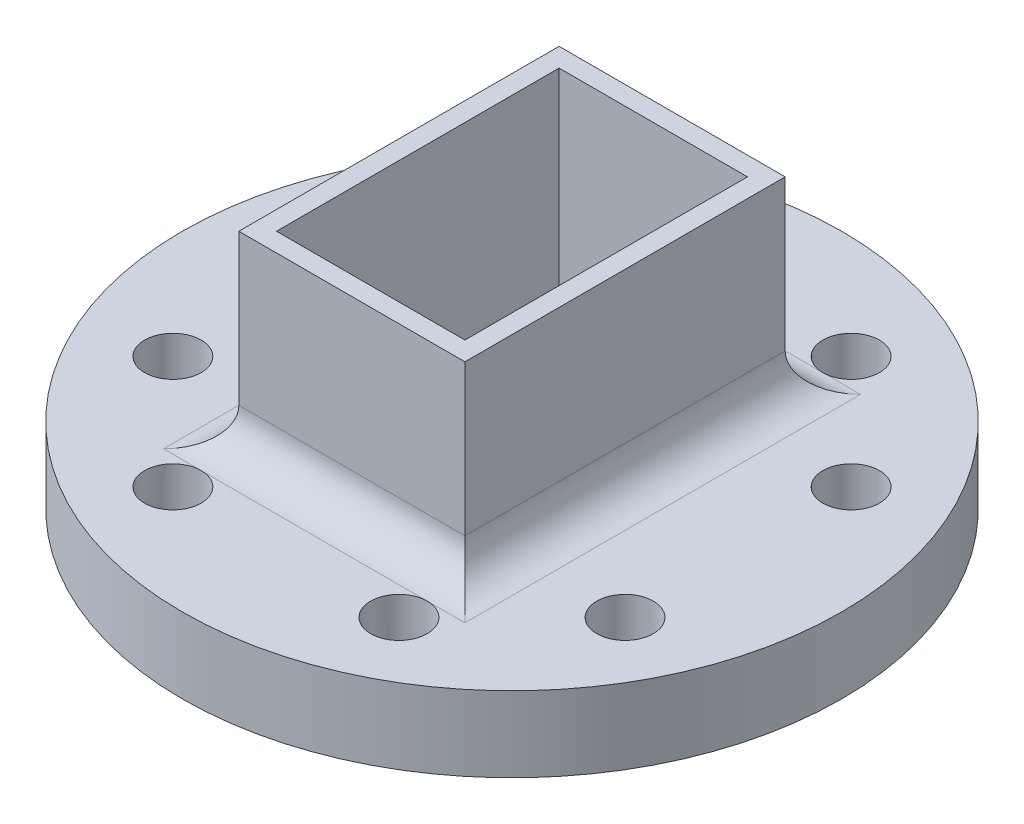
ISO-10303-21;
HEADER;
FILE_DESCRIPTION(('STEP AP214'),'2;1');
FILE_NAME('part.step','',(''),(''),'','','');
FILE_SCHEMA(('AUTOMOTIVE_DESIGN { 1 0 10303 214 1 1 1 1 }'));
ENDSEC;
DATA;
#1=APPLICATION_CONTEXT('core data for automotive mechanical design processes');
#2=APPLICATION_PROTOCOL_DEFINITION('international standard','automotive_design',2000,#1);
#3=PRODUCT_CONTEXT('',#1,'mechanical');
#4=PRODUCT('Part','Part','',(#3));
#5=PRODUCT_RELATED_PRODUCT_CATEGORY('part','',(#4));
#6=PRODUCT_DEFINITION_FORMATION('','',#4);
#7=PRODUCT_DEFINITION_CONTEXT('part definition',#1,'design');
#8=PRODUCT_DEFINITION('design','',#6,#7);
#9=PRODUCT_DEFINITION_SHAPE('','',#8);
#10=(LENGTH_UNIT() NAMED_UNIT(*) SI_UNIT(.MILLI.,.METRE.));
#11=(NAMED_UNIT(*) PLANE_ANGLE_UNIT() SI_UNIT($,.RADIAN.));
#12=(NAMED_UNIT(*) SI_UNIT($,.STERADIAN.) SOLID_ANGLE_UNIT());
#13=UNCERTAINTY_MEASURE_WITH_UNIT(LENGTH_MEASURE(1.E-05),#10,'distance_accuracy_value','');
#14=(GEOMETRIC_REPRESENTATION_CONTEXT(3) GLOBAL_UNCERTAINTY_ASSIGNED_CONTEXT((#13)) GLOBAL_UNIT_ASSIGNED_CONTEXT((#10,
#11,#12)) REPRESENTATION_CONTEXT('',''));
#15=CARTESIAN_POINT('',(0.,0.,0.));
#16=DIRECTION('',(0.,0.,1.));
#17=DIRECTION('',(1.,0.,0.));
#18=AXIS2_PLACEMENT_3D('',#15,#16,#17);
#19=CARTESIAN_POINT('',(0.,4.,0.));
#20=DIRECTION('',(0.,1.,0.));
#21=DIRECTION('',(0.,0.,1.));
#22=AXIS2_PLACEMENT_3D('',#19,#20,#21);
#23=PLANE('',#22);
#24=CARTESIAN_POINT('',(-1.83013326715553E-12,4.,-6.09755301805848E-13));
#25=DIRECTION('',(0.,1.,0.));
#26=DIRECTION('',(0.,0.,1.));
#27=AXIS2_PLACEMENT_3D('',#24,#25,#26);
#28=CIRCLE('',#27,17.5);
#29=CARTESIAN_POINT('',(-1.83013326715553E-12,4.,17.4999999999994));
#30=VERTEX_POINT('',#29);
#31=EDGE_CURVE('E246',#30,#30,#28,.T.);
#32=ORIENTED_EDGE('',*,*,#31,.T.);
#33=EDGE_LOOP('',(#32));
#34=FACE_BOUND('',#33,.T.);
#35=CARTESIAN_POINT('',(-6.00000000000198,4.,-11.999999999999));
#36=DIRECTION('',(0.,1.,0.));
#37=DIRECTION('',(0.,0.,1.));
#38=AXIS2_PLACEMENT_3D('',#35,#36,#37);
#39=CIRCLE('',#38,1.49999999999963);
#40=CARTESIAN_POINT('',(-6.00000000000198,4.,-10.5));
#41=VERTEX_POINT('',#40);
#42=EDGE_CURVE('E242',#41,#41,#39,.T.);
#43=ORIENTED_EDGE('',*,*,#42,.F.);
#44=DIRECTION('',(-1.,0.,0.));
#45=VECTOR('',#44,1.);
#46=CARTESIAN_POINT('',(0.,4.,-10.5));
#47=LINE('',#46,#45);
#48=CARTESIAN_POINT('',(5.99999999999802,4.,-10.5));
#49=VERTEX_POINT('',#48);
#50=EDGE_CURVE('E310',#41,#49,#47,.F.);
#51=ORIENTED_EDGE('',*,*,#50,.T.);
#52=CARTESIAN_POINT('',(5.99999999999802,4.,-11.9999999999986));
#53=DIRECTION('',(0.,1.,0.));
#54=DIRECTION('',(0.,0.,1.));
#55=AXIS2_PLACEMENT_3D('',#52,#53,#54);
#56=CIRCLE('',#55,1.49999999999923);
#57=EDGE_CURVE('E238',#49,#49,#56,.T.);
#58=ORIENTED_EDGE('',*,*,#57,.F.);
#59=DIRECTION('',(-1.,0.,0.));
#60=VECTOR('',#59,1.);
#61=CARTESIAN_POINT('',(0.,4.,-10.5));
#62=LINE('',#61,#60);
#63=CARTESIAN_POINT('',(8.,4.,-10.5));
#64=VERTEX_POINT('',#63);
#65=EDGE_CURVE('E307',#49,#64,#62,.F.);
#66=ORIENTED_EDGE('',*,*,#65,.T.);
#67=DIRECTION('',(0.,0.,-1.));
#68=VECTOR('',#67,1.);
#69=CARTESIAN_POINT('',(8.,4.,0.));
#70=LINE('',#69,#68);
#71=CARTESIAN_POINT('',(8.,4.,10.5));
#72=VERTEX_POINT('',#71);
#73=EDGE_CURVE('E303',#64,#72,#70,.F.);
#74=ORIENTED_EDGE('',*,*,#73,.T.);
#75=DIRECTION('',(1.,0.,0.));
#76=VECTOR('',#75,1.);
#77=CARTESIAN_POINT('',(0.,4.,10.5));
#78=LINE('',#77,#76);
#79=CARTESIAN_POINT('',(5.9999999999971,4.,10.5));
#80=VERTEX_POINT('',#79);
#81=EDGE_CURVE('E294',#72,#80,#78,.F.);
#82=ORIENTED_EDGE('',*,*,#81,.T.);
#83=CARTESIAN_POINT('',(5.9999999999971,4.,12.0000000000015));
#84=DIRECTION('',(0.,1.,0.));
#85=DIRECTION('',(0.,0.,1.));
#86=AXIS2_PLACEMENT_3D('',#83,#84,#85);
#87=CIRCLE('',#86,1.49999999999947);
#88=EDGE_CURVE('E226',#80,#80,#87,.T.);
#89=ORIENTED_EDGE('',*,*,#88,.F.);
#90=DIRECTION('',(1.,0.,0.));
#91=VECTOR('',#90,1.);
#92=CARTESIAN_POINT('',(0.,4.,10.5));
#93=LINE('',#92,#91);
#94=CARTESIAN_POINT('',(-6.0000000000029,4.,10.5));
#95=VERTEX_POINT('',#94);
#96=EDGE_CURVE('E291',#80,#95,#93,.F.);
#97=ORIENTED_EDGE('',*,*,#96,.T.);
#98=CARTESIAN_POINT('',(-6.0000000000029,4.,12.000000000001));
#99=DIRECTION('',(0.,1.,0.));
#100=DIRECTION('',(0.,0.,1.));
#101=AXIS2_PLACEMENT_3D('',#98,#99,#100);
#102=CIRCLE('',#101,1.49999999999987);
#103=EDGE_CURVE('E222',#95,#95,#102,.T.);
#104=ORIENTED_EDGE('',*,*,#103,.F.);
#105=DIRECTION('',(1.,0.,0.));
#106=VECTOR('',#105,1.);
#107=CARTESIAN_POINT('',(0.,4.,10.5));
#108=LINE('',#107,#106);
#109=CARTESIAN_POINT('',(-8.,4.,10.5));
#110=VERTEX_POINT('',#109);
#111=EDGE_CURVE('E288',#95,#110,#108,.F.);
#112=ORIENTED_EDGE('',*,*,#111,.T.);
#113=DIRECTION('',(0.,0.,1.));
#114=VECTOR('',#113,1.);
#115=CARTESIAN_POINT('',(-8.,4.,0.));
#116=LINE('',#115,#114);
#117=CARTESIAN_POINT('',(-8.,4.,-10.5));
#118=VERTEX_POINT('',#117);
#119=EDGE_CURVE('E297',#110,#118,#116,.F.);
#120=ORIENTED_EDGE('',*,*,#119,.T.);
#121=DIRECTION('',(-1.,0.,0.));
#122=VECTOR('',#121,1.);
#123=CARTESIAN_POINT('',(0.,4.,-10.5));
#124=LINE('',#123,#122);
#125=EDGE_CURVE('E300',#118,#41,#124,.F.);
#126=ORIENTED_EDGE('',*,*,#125,.T.);
#127=EDGE_LOOP('',(#43,#51,#58,#66,#74,#82,#89,#97,#104,#112,#120,#126));
#128=FACE_BOUND('',#127,.T.);
#129=CARTESIAN_POINT('',(12.,4.,-6.));
#130=DIRECTION('',(0.,1.,0.));
#131=DIRECTION('',(0.,0.,1.));
#132=AXIS2_PLACEMENT_3D('',#129,#130,#131);
#133=CIRCLE('',#132,1.5);
#134=CARTESIAN_POINT('',(12.,4.,-4.5));
#135=VERTEX_POINT('',#134);
#136=EDGE_CURVE('E234',#135,#135,#133,.T.);
#137=ORIENTED_EDGE('',*,*,#136,.F.);
#138=EDGE_LOOP('',(#137));
#139=FACE_BOUND('',#138,.T.);
#140=CARTESIAN_POINT('',(12.,4.,6.));
#141=DIRECTION('',(0.,1.,0.));
#142=DIRECTION('',(0.,0.,1.));
#143=AXIS2_PLACEMENT_3D('',#140,#141,#142);
#144=CIRCLE('',#143,1.5);
#145=CARTESIAN_POINT('',(12.,4.,7.5));
#146=VERTEX_POINT('',#145);
#147=EDGE_CURVE('E230',#146,#146,#144,.T.);
#148=ORIENTED_EDGE('',*,*,#147,.F.);
#149=EDGE_LOOP('',(#148));
#150=FACE_BOUND('',#149,.T.);
#151=CARTESIAN_POINT('',(-12.,4.,6.));
#152=DIRECTION('',(0.,1.,0.));
#153=DIRECTION('',(0.,0.,1.));
#154=AXIS2_PLACEMENT_3D('',#151,#152,#153);
#155=CIRCLE('',#154,1.5);
#156=CARTESIAN_POINT('',(-12.,4.,7.5));
#157=VERTEX_POINT('',#156);
#158=EDGE_CURVE('E217',#157,#157,#155,.T.);
#159=ORIENTED_EDGE('',*,*,#158,.F.);
#160=EDGE_LOOP('',(#159));
#161=FACE_BOUND('',#160,.T.);
#162=CARTESIAN_POINT('',(-12.,4.,-6.));
#163=DIRECTION('',(0.,1.,0.));
#164=DIRECTION('',(0.,0.,1.));
#165=AXIS2_PLACEMENT_3D('',#162,#163,#164);
#166=CIRCLE('',#165,1.5);
#167=CARTESIAN_POINT('',(-12.,4.,-4.5));
#168=VERTEX_POINT('',#167);
#169=EDGE_CURVE('E213',#168,#168,#166,.T.);
#170=ORIENTED_EDGE('',*,*,#169,.F.);
#171=EDGE_LOOP('',(#170));
#172=FACE_BOUND('',#171,.T.);
#173=ADVANCED_FACE('F39',(#34,#128,#139,#150,#161,#172),#23,.T.);
#174=CARTESIAN_POINT('',(-6.00000000000198,4.,-11.999999999999));
#175=DIRECTION('',(0.,-1.,0.));
#176=DIRECTION('',(0.,0.,-1.));
#177=AXIS2_PLACEMENT_3D('',#174,#175,#176);
#178=CYLINDRICAL_SURFACE('',#177,1.49999999999963);
#179=ORIENTED_EDGE('',*,*,#42,.T.);
#180=EDGE_LOOP('',(#179));
#181=FACE_BOUND('',#180,.T.);
#182=CARTESIAN_POINT('',(-6.00000000000198,0.,-11.999999999999));
#183=DIRECTION('',(0.,1.,0.));
#184=DIRECTION('',(0.,0.,1.));
#185=AXIS2_PLACEMENT_3D('',#182,#183,#184);
#186=CIRCLE('',#185,1.49999999999963);
#187=CARTESIAN_POINT('',(-6.00000000000198,0.,-10.4999999999994));
#188=VERTEX_POINT('',#187);
#189=EDGE_CURVE('E278',#188,#188,#186,.T.);
#190=ORIENTED_EDGE('',*,*,#189,.F.);
#191=EDGE_LOOP('',(#190));
#192=FACE_BOUND('',#191,.T.);
#193=ADVANCED_FACE('F383',(#181,#192),#178,.F.);
#194=CARTESIAN_POINT('',(5.99999999999802,4.,-11.9999999999986));
#195=DIRECTION('',(0.,-1.,0.));
#196=DIRECTION('',(0.,0.,-1.));
#197=AXIS2_PLACEMENT_3D('',#194,#195,#196);
#198=CYLINDRICAL_SURFACE('',#197,1.49999999999923);
#199=ORIENTED_EDGE('',*,*,#57,.T.);
#200=EDGE_LOOP('',(#199));
#201=FACE_BOUND('',#200,.T.);
#202=CARTESIAN_POINT('',(5.99999999999802,0.,-11.9999999999986));
#203=DIRECTION('',(0.,1.,0.));
#204=DIRECTION('',(0.,0.,1.));
#205=AXIS2_PLACEMENT_3D('',#202,#203,#204);
#206=CIRCLE('',#205,1.49999999999923);
#207=CARTESIAN_POINT('',(5.99999999999802,0.,-10.4999999999993));
#208=VERTEX_POINT('',#207);
#209=EDGE_CURVE('E274',#208,#208,#206,.T.);
#210=ORIENTED_EDGE('',*,*,#209,.F.);
#211=EDGE_LOOP('',(#210));
#212=FACE_BOUND('',#211,.T.);
#213=ADVANCED_FACE('F390',(#201,#212),#198,.F.);
#214=CARTESIAN_POINT('',(12.,4.,-6.));
#215=DIRECTION('',(0.,-1.,0.));
#216=DIRECTION('',(0.,0.,-1.));
#217=AXIS2_PLACEMENT_3D('',#214,#215,#216);
#218=CYLINDRICAL_SURFACE('',#217,1.5);
#219=ORIENTED_EDGE('',*,*,#136,.T.);
#220=EDGE_LOOP('',(#219));
#221=FACE_BOUND('',#220,.T.);
#222=CARTESIAN_POINT('',(12.,0.,-6.));
#223=DIRECTION('',(0.,1.,0.));
#224=DIRECTION('',(0.,0.,1.));
#225=AXIS2_PLACEMENT_3D('',#222,#223,#224);
#226=CIRCLE('',#225,1.5);
#227=CARTESIAN_POINT('',(12.,0.,-4.5));
#228=VERTEX_POINT('',#227);
#229=EDGE_CURVE('E270',#228,#228,#226,.T.);
#230=ORIENTED_EDGE('',*,*,#229,.F.);
#231=EDGE_LOOP('',(#230));
#232=FACE_BOUND('',#231,.T.);
#233=ADVANCED_FACE('F462',(#221,#232),#218,.F.);
#234=CARTESIAN_POINT('',(12.,4.,6.));
#235=DIRECTION('',(0.,-1.,0.));
#236=DIRECTION('',(0.,0.,-1.));
#237=AXIS2_PLACEMENT_3D('',#234,#235,#236);
#238=CYLINDRICAL_SURFACE('',#237,1.5);
#239=ORIENTED_EDGE('',*,*,#147,.T.);
#240=EDGE_LOOP('',(#239));
#241=FACE_BOUND('',#240,.T.);
#242=CARTESIAN_POINT('',(12.,0.,6.));
#243=DIRECTION('',(0.,1.,0.));
#244=DIRECTION('',(0.,0.,1.));
#245=AXIS2_PLACEMENT_3D('',#242,#243,#244);
#246=CIRCLE('',#245,1.5);
#247=CARTESIAN_POINT('',(12.,0.,7.5));
#248=VERTEX_POINT('',#247);
#249=EDGE_CURVE('E266',#248,#248,#246,.T.);
#250=ORIENTED_EDGE('',*,*,#249,.F.);
#251=EDGE_LOOP('',(#250));
#252=FACE_BOUND('',#251,.T.);
#253=ADVANCED_FACE('F458',(#241,#252),#238,.F.);
#254=CARTESIAN_POINT('',(5.9999999999971,4.,12.0000000000015));
#255=DIRECTION('',(0.,-1.,0.));
#256=DIRECTION('',(0.,0.,-1.));
#257=AXIS2_PLACEMENT_3D('',#254,#255,#256);
#258=CYLINDRICAL_SURFACE('',#257,1.49999999999947);
#259=ORIENTED_EDGE('',*,*,#88,.T.);
#260=EDGE_LOOP('',(#259));
#261=FACE_BOUND('',#260,.T.);
#262=CARTESIAN_POINT('',(5.9999999999971,0.,12.0000000000015));
#263=DIRECTION('',(0.,1.,0.));
#264=DIRECTION('',(0.,0.,1.));
#265=AXIS2_PLACEMENT_3D('',#262,#263,#264);
#266=CIRCLE('',#265,1.49999999999947);
#267=CARTESIAN_POINT('',(5.9999999999971,0.,13.5000000000009));
#268=VERTEX_POINT('',#267);
#269=EDGE_CURVE('E262',#268,#268,#266,.T.);
#270=ORIENTED_EDGE('',*,*,#269,.F.);
#271=EDGE_LOOP('',(#270));
#272=FACE_BOUND('',#271,.T.);
#273=ADVANCED_FACE('F349',(#261,#272),#258,.F.);
#274=CARTESIAN_POINT('',(-6.0000000000029,4.,12.000000000001));
#275=DIRECTION('',(0.,-1.,0.));
#276=DIRECTION('',(0.,0.,-1.));
#277=AXIS2_PLACEMENT_3D('',#274,#275,#276);
#278=CYLINDRICAL_SURFACE('',#277,1.49999999999987);
#279=ORIENTED_EDGE('',*,*,#103,.T.);
#280=EDGE_LOOP('',(#279));
#281=FACE_BOUND('',#280,.T.);
#282=CARTESIAN_POINT('',(-6.0000000000029,0.,12.000000000001));
#283=DIRECTION('',(0.,1.,0.));
#284=DIRECTION('',(0.,0.,1.));
#285=AXIS2_PLACEMENT_3D('',#282,#283,#284);
#286=CIRCLE('',#285,1.49999999999987);
#287=CARTESIAN_POINT('',(-6.0000000000029,0.,13.5000000000009));
#288=VERTEX_POINT('',#287);
#289=EDGE_CURVE('E258',#288,#288,#286,.T.);
#290=ORIENTED_EDGE('',*,*,#289,.F.);
#291=EDGE_LOOP('',(#290));
#292=FACE_BOUND('',#291,.T.);
#293=ADVANCED_FACE('F345',(#281,#292),#278,.F.);
#294=CARTESIAN_POINT('',(-12.,4.,6.));
#295=DIRECTION('',(0.,-1.,0.));
#296=DIRECTION('',(0.,0.,-1.));
#297=AXIS2_PLACEMENT_3D('',#294,#295,#296);
#298=CYLINDRICAL_SURFACE('',#297,1.5);
#299=ORIENTED_EDGE('',*,*,#158,.T.);
#300=EDGE_LOOP('',(#299));
#301=FACE_BOUND('',#300,.T.);
#302=CARTESIAN_POINT('',(-12.,0.,6.));
#303=DIRECTION('',(0.,1.,0.));
#304=DIRECTION('',(0.,0.,1.));
#305=AXIS2_PLACEMENT_3D('',#302,#303,#304);
#306=CIRCLE('',#305,1.5);
#307=CARTESIAN_POINT('',(-12.,0.,7.5));
#308=VERTEX_POINT('',#307);
#309=EDGE_CURVE('E254',#308,#308,#306,.T.);
#310=ORIENTED_EDGE('',*,*,#309,.F.);
#311=EDGE_LOOP('',(#310));
#312=FACE_BOUND('',#311,.T.);
#313=ADVANCED_FACE('F348',(#301,#312),#298,.F.);
#314=CARTESIAN_POINT('',(-12.,4.,-6.));
#315=DIRECTION('',(0.,-1.,0.));
#316=DIRECTION('',(0.,0.,-1.));
#317=AXIS2_PLACEMENT_3D('',#314,#315,#316);
#318=CYLINDRICAL_SURFACE('',#317,1.5);
#319=ORIENTED_EDGE('',*,*,#169,.T.);
#320=EDGE_LOOP('',(#319));
#321=FACE_BOUND('',#320,.T.);
#322=CARTESIAN_POINT('',(-12.,0.,-6.));
#323=DIRECTION('',(0.,1.,0.));
#324=DIRECTION('',(0.,0.,1.));
#325=AXIS2_PLACEMENT_3D('',#322,#323,#324);
#326=CIRCLE('',#325,1.5);
#327=CARTESIAN_POINT('',(-12.,0.,-4.5));
#328=VERTEX_POINT('',#327);
#329=EDGE_CURVE('E212',#328,#328,#326,.T.);
#330=ORIENTED_EDGE('',*,*,#329,.F.);
#331=EDGE_LOOP('',(#330));
#332=FACE_BOUND('',#331,.T.);
#333=ADVANCED_FACE('F372',(#321,#332),#318,.F.);
#334=CARTESIAN_POINT('',(-1.83013326715553E-12,4.,-6.09755301805848E-13));
#335=DIRECTION('',(0.,-1.,0.));
#336=DIRECTION('',(0.,0.,-1.));
#337=AXIS2_PLACEMENT_3D('',#334,#335,#336);
#338=CYLINDRICAL_SURFACE('',#337,17.5);
#339=ORIENTED_EDGE('',*,*,#31,.F.);
#340=EDGE_LOOP('',(#339));
#341=FACE_BOUND('',#340,.T.);
#342=CARTESIAN_POINT('',(-1.83013326715553E-12,0.,-6.09755301805848E-13));
#343=DIRECTION('',(0.,1.,0.));
#344=DIRECTION('',(0.,0.,1.));
#345=AXIS2_PLACEMENT_3D('',#342,#343,#344);
#346=CIRCLE('',#345,17.5);
#347=CARTESIAN_POINT('',(-1.83013326715553E-12,0.,17.4999999999994));
#348=VERTEX_POINT('',#347);
#349=EDGE_CURVE('E218',#348,#348,#346,.T.);
#350=ORIENTED_EDGE('',*,*,#349,.T.);
#351=EDGE_LOOP('',(#350));
#352=FACE_BOUND('',#351,.T.);
#353=ADVANCED_FACE('F356',(#341,#352),#338,.T.);
#354=CARTESIAN_POINT('',(0.,0.,0.));
#355=DIRECTION('',(0.,1.,0.));
#356=DIRECTION('',(0.,0.,1.));
#357=AXIS2_PLACEMENT_3D('',#354,#355,#356);
#358=PLANE('',#357);
#359=ORIENTED_EDGE('',*,*,#329,.T.);
#360=EDGE_LOOP('',(#359));
#361=FACE_BOUND('',#360,.T.);
#362=ORIENTED_EDGE('',*,*,#309,.T.);
#363=EDGE_LOOP('',(#362));
#364=FACE_BOUND('',#363,.T.);
#365=ORIENTED_EDGE('',*,*,#289,.T.);
#366=EDGE_LOOP('',(#365));
#367=FACE_BOUND('',#366,.T.);
#368=ORIENTED_EDGE('',*,*,#269,.T.);
#369=EDGE_LOOP('',(#368));
#370=FACE_BOUND('',#369,.T.);
#371=ORIENTED_EDGE('',*,*,#249,.T.);
#372=EDGE_LOOP('',(#371));
#373=FACE_BOUND('',#372,.T.);
#374=ORIENTED_EDGE('',*,*,#229,.T.);
#375=EDGE_LOOP('',(#374));
#376=FACE_BOUND('',#375,.T.);
#377=ORIENTED_EDGE('',*,*,#209,.T.);
#378=EDGE_LOOP('',(#377));
#379=FACE_BOUND('',#378,.T.);
#380=ORIENTED_EDGE('',*,*,#189,.T.);
#381=EDGE_LOOP('',(#380));
#382=FACE_BOUND('',#381,.T.);
#383=ORIENTED_EDGE('',*,*,#349,.F.);
#384=EDGE_LOOP('',(#383));
#385=FACE_BOUND('',#384,.T.);
#386=ADVANCED_FACE('F353',(#361,#364,#367,#370,#373,#376,#379,#382,#385),#358,.F.);
#387=CARTESIAN_POINT('',(0.,14.,0.));
#388=DIRECTION('',(0.,-1.,0.));
#389=DIRECTION('',(0.,0.,-1.));
#390=AXIS2_PLACEMENT_3D('',#387,#388,#389);
#391=PLANE('',#390);
#392=DIRECTION('',(0.,0.,1.));
#393=VECTOR('',#392,1.);
#394=CARTESIAN_POINT('',(-6.,14.,8.5));
#395=LINE('',#394,#393);
#396=CARTESIAN_POINT('',(-6.,14.,-8.5));
#397=VERTEX_POINT('',#396);
#398=CARTESIAN_POINT('',(-6.,14.,8.5));
#399=VERTEX_POINT('',#398);
#400=EDGE_CURVE('E154',#397,#399,#395,.T.);
#401=ORIENTED_EDGE('',*,*,#400,.T.);
#402=DIRECTION('',(1.,0.,0.));
#403=VECTOR('',#402,1.);
#404=CARTESIAN_POINT('',(-6.,14.,8.5));
#405=LINE('',#404,#403);
#406=CARTESIAN_POINT('',(6.,14.,8.5));
#407=VERTEX_POINT('',#406);
#408=EDGE_CURVE('E190',#399,#407,#405,.T.);
#409=ORIENTED_EDGE('',*,*,#408,.T.);
#410=DIRECTION('',(0.,0.,-1.));
#411=VECTOR('',#410,1.);
#412=CARTESIAN_POINT('',(6.,14.,8.5));
#413=LINE('',#412,#411);
#414=CARTESIAN_POINT('',(6.,14.,-8.5));
#415=VERTEX_POINT('',#414);
#416=EDGE_CURVE('E193',#407,#415,#413,.T.);
#417=ORIENTED_EDGE('',*,*,#416,.T.);
#418=DIRECTION('',(-1.,0.,0.));
#419=VECTOR('',#418,1.);
#420=CARTESIAN_POINT('',(-6.,14.,-8.5));
#421=LINE('',#420,#419);
#422=EDGE_CURVE('E196',#415,#397,#421,.T.);
#423=ORIENTED_EDGE('',*,*,#422,.T.);
#424=EDGE_LOOP('',(#401,#409,#417,#423));
#425=FACE_BOUND('',#424,.T.);
#426=DIRECTION('',(0.,0.,-1.));
#427=VECTOR('',#426,1.);
#428=CARTESIAN_POINT('',(5.,14.,7.5));
#429=LINE('',#428,#427);
#430=CARTESIAN_POINT('',(5.,14.,7.5));
#431=VERTEX_POINT('',#430);
#432=CARTESIAN_POINT('',(5.,14.,-7.5));
#433=VERTEX_POINT('',#432);
#434=EDGE_CURVE('E133',#431,#433,#429,.T.);
#435=ORIENTED_EDGE('',*,*,#434,.F.);
#436=DIRECTION('',(1.,0.,0.));
#437=VECTOR('',#436,1.);
#438=CARTESIAN_POINT('',(-5.,14.,7.5));
#439=LINE('',#438,#437);
#440=CARTESIAN_POINT('',(-5.,14.,7.5));
#441=VERTEX_POINT('',#440);
#442=EDGE_CURVE('E164',#441,#431,#439,.T.);
#443=ORIENTED_EDGE('',*,*,#442,.F.);
#444=DIRECTION('',(0.,0.,1.));
#445=VECTOR('',#444,1.);
#446=CARTESIAN_POINT('',(-5.,14.,7.5));
#447=LINE('',#446,#445);
#448=CARTESIAN_POINT('',(-5.,14.,-7.5));
#449=VERTEX_POINT('',#448);
#450=EDGE_CURVE('E160',#449,#441,#447,.T.);
#451=ORIENTED_EDGE('',*,*,#450,.F.);
#452=DIRECTION('',(-1.,0.,0.));
#453=VECTOR('',#452,1.);
#454=CARTESIAN_POINT('',(-5.,14.,-7.5));
#455=LINE('',#454,#453);
#456=EDGE_CURVE('E144',#433,#449,#455,.T.);
#457=ORIENTED_EDGE('',*,*,#456,.F.);
#458=EDGE_LOOP('',(#435,#443,#451,#457));
#459=FACE_BOUND('',#458,.T.);
#460=ADVANCED_FACE('F158',(#425,#459),#391,.F.);
#461=CARTESIAN_POINT('',(-6.,14.,8.5));
#462=DIRECTION('',(1.,0.,0.));
#463=DIRECTION('',(0.,0.,-1.));
#464=AXIS2_PLACEMENT_3D('',#461,#462,#463);
#465=PLANE('',#464);
#466=DIRECTION('',(0.,-1.,0.));
#467=VECTOR('',#466,1.);
#468=CARTESIAN_POINT('',(-6.,14.,-8.5));
#469=LINE('',#468,#467);
#470=CARTESIAN_POINT('',(-6.,6.,-8.5));
#471=VERTEX_POINT('',#470);
#472=EDGE_CURVE('E199',#397,#471,#469,.T.);
#473=ORIENTED_EDGE('',*,*,#472,.T.);
#474=DIRECTION('',(0.,0.,1.));
#475=VECTOR('',#474,1.);
#476=CARTESIAN_POINT('',(-6.,6.,8.5));
#477=LINE('',#476,#475);
#478=CARTESIAN_POINT('',(-6.,6.,8.5));
#479=VERTEX_POINT('',#478);
#480=EDGE_CURVE('E49',#471,#479,#477,.T.);
#481=ORIENTED_EDGE('',*,*,#480,.T.);
#482=DIRECTION('',(0.,-1.,0.));
#483=VECTOR('',#482,1.);
#484=CARTESIAN_POINT('',(-6.,14.,8.5));
#485=LINE('',#484,#483);
#486=EDGE_CURVE('E209',#399,#479,#485,.T.);
#487=ORIENTED_EDGE('',*,*,#486,.F.);
#488=ORIENTED_EDGE('',*,*,#400,.F.);
#489=EDGE_LOOP('',(#473,#481,#487,#488));
#490=FACE_BOUND('',#489,.T.);
#491=ADVANCED_FACE('F418',(#490),#465,.F.);
#492=CARTESIAN_POINT('',(-6.,14.,8.5));
#493=DIRECTION('',(0.,0.,-1.));
#494=DIRECTION('',(-1.,0.,0.));
#495=AXIS2_PLACEMENT_3D('',#492,#493,#494);
#496=PLANE('',#495);
#497=ORIENTED_EDGE('',*,*,#486,.T.);
#498=DIRECTION('',(1.,0.,0.));
#499=VECTOR('',#498,1.);
#500=CARTESIAN_POINT('',(-6.,6.,8.5));
#501=LINE('',#500,#499);
#502=CARTESIAN_POINT('',(6.,6.,8.5));
#503=VERTEX_POINT('',#502);
#504=EDGE_CURVE('E11',#479,#503,#501,.T.);
#505=ORIENTED_EDGE('',*,*,#504,.T.);
#506=DIRECTION('',(0.,-1.,0.));
#507=VECTOR('',#506,1.);
#508=CARTESIAN_POINT('',(6.,14.,8.5));
#509=LINE('',#508,#507);
#510=EDGE_CURVE('E205',#407,#503,#509,.T.);
#511=ORIENTED_EDGE('',*,*,#510,.F.);
#512=ORIENTED_EDGE('',*,*,#408,.F.);
#513=EDGE_LOOP('',(#497,#505,#511,#512));
#514=FACE_BOUND('',#513,.T.);
#515=ADVANCED_FACE('F425',(#514),#496,.F.);
#516=CARTESIAN_POINT('',(6.,14.,8.5));
#517=DIRECTION('',(-1.,0.,0.));
#518=DIRECTION('',(0.,0.,1.));
#519=AXIS2_PLACEMENT_3D('',#516,#517,#518);
#520=PLANE('',#519);
#521=ORIENTED_EDGE('',*,*,#510,.T.);
#522=DIRECTION('',(0.,0.,-1.));
#523=VECTOR('',#522,1.);
#524=CARTESIAN_POINT('',(6.,6.,8.5));
#525=LINE('',#524,#523);
#526=CARTESIAN_POINT('',(6.,6.,-8.5));
#527=VERTEX_POINT('',#526);
#528=EDGE_CURVE('E250',#503,#527,#525,.T.);
#529=ORIENTED_EDGE('',*,*,#528,.T.);
#530=DIRECTION('',(0.,-1.,0.));
#531=VECTOR('',#530,1.);
#532=CARTESIAN_POINT('',(6.,14.,-8.5));
#533=LINE('',#532,#531);
#534=EDGE_CURVE('E202',#415,#527,#533,.T.);
#535=ORIENTED_EDGE('',*,*,#534,.F.);
#536=ORIENTED_EDGE('',*,*,#416,.F.);
#537=EDGE_LOOP('',(#521,#529,#535,#536));
#538=FACE_BOUND('',#537,.T.);
#539=ADVANCED_FACE('F422',(#538),#520,.F.);
#540=CARTESIAN_POINT('',(-6.,14.,-8.5));
#541=DIRECTION('',(0.,0.,1.));
#542=DIRECTION('',(1.,0.,0.));
#543=AXIS2_PLACEMENT_3D('',#540,#541,#542);
#544=PLANE('',#543);
#545=ORIENTED_EDGE('',*,*,#534,.T.);
#546=DIRECTION('',(-1.,0.,0.));
#547=VECTOR('',#546,1.);
#548=CARTESIAN_POINT('',(-6.,6.,-8.5));
#549=LINE('',#548,#547);
#550=EDGE_CURVE('E64',#527,#471,#549,.T.);
#551=ORIENTED_EDGE('',*,*,#550,.T.);
#552=ORIENTED_EDGE('',*,*,#472,.F.);
#553=ORIENTED_EDGE('',*,*,#422,.F.);
#554=EDGE_LOOP('',(#545,#551,#552,#553));
#555=FACE_BOUND('',#554,.T.);
#556=ADVANCED_FACE('F415',(#555),#544,.F.);
#557=CARTESIAN_POINT('',(5.,14.,7.5));
#558=DIRECTION('',(-1.,0.,0.));
#559=DIRECTION('',(0.,0.,1.));
#560=AXIS2_PLACEMENT_3D('',#557,#558,#559);
#561=PLANE('',#560);
#562=DIRECTION('',(0.,0.,-1.));
#563=VECTOR('',#562,1.);
#564=CARTESIAN_POINT('',(5.,4.,7.5));
#565=LINE('',#564,#563);
#566=CARTESIAN_POINT('',(5.,4.,7.5));
#567=VERTEX_POINT('',#566);
#568=CARTESIAN_POINT('',(5.,4.,-7.5));
#569=VERTEX_POINT('',#568);
#570=EDGE_CURVE('E169',#567,#569,#565,.T.);
#571=ORIENTED_EDGE('',*,*,#570,.F.);
#572=DIRECTION('',(0.,-1.,0.));
#573=VECTOR('',#572,1.);
#574=CARTESIAN_POINT('',(5.,14.,7.5));
#575=LINE('',#574,#573);
#576=EDGE_CURVE('E139',#431,#567,#575,.T.);
#577=ORIENTED_EDGE('',*,*,#576,.F.);
#578=ORIENTED_EDGE('',*,*,#434,.T.);
#579=DIRECTION('',(0.,-1.,0.));
#580=VECTOR('',#579,1.);
#581=CARTESIAN_POINT('',(5.,14.,-7.5));
#582=LINE('',#581,#580);
#583=EDGE_CURVE('E137',#433,#569,#582,.T.);
#584=ORIENTED_EDGE('',*,*,#583,.T.);
#585=EDGE_LOOP('',(#571,#577,#578,#584));
#586=FACE_BOUND('',#585,.T.);
#587=ADVANCED_FACE('F136',(#586),#561,.T.);
#588=CARTESIAN_POINT('',(-5.,14.,-7.5));
#589=DIRECTION('',(0.,0.,1.));
#590=DIRECTION('',(1.,0.,0.));
#591=AXIS2_PLACEMENT_3D('',#588,#589,#590);
#592=PLANE('',#591);
#593=DIRECTION('',(-1.,0.,0.));
#594=VECTOR('',#593,1.);
#595=CARTESIAN_POINT('',(-5.,4.,-7.5));
#596=LINE('',#595,#594);
#597=CARTESIAN_POINT('',(-5.,4.,-7.5));
#598=VERTEX_POINT('',#597);
#599=EDGE_CURVE('E152',#569,#598,#596,.T.);
#600=ORIENTED_EDGE('',*,*,#599,.F.);
#601=ORIENTED_EDGE('',*,*,#583,.F.);
#602=ORIENTED_EDGE('',*,*,#456,.T.);
#603=DIRECTION('',(0.,-1.,0.));
#604=VECTOR('',#603,1.);
#605=CARTESIAN_POINT('',(-5.,14.,-7.5));
#606=LINE('',#605,#604);
#607=EDGE_CURVE('E155',#449,#598,#606,.T.);
#608=ORIENTED_EDGE('',*,*,#607,.T.);
#609=EDGE_LOOP('',(#600,#601,#602,#608));
#610=FACE_BOUND('',#609,.T.);
#611=ADVANCED_FACE('F149',(#610),#592,.T.);
#612=CARTESIAN_POINT('',(-5.,14.,7.5));
#613=DIRECTION('',(1.,0.,0.));
#614=DIRECTION('',(0.,0.,-1.));
#615=AXIS2_PLACEMENT_3D('',#612,#613,#614);
#616=PLANE('',#615);
#617=DIRECTION('',(0.,0.,1.));
#618=VECTOR('',#617,1.);
#619=CARTESIAN_POINT('',(-5.,4.,7.5));
#620=LINE('',#619,#618);
#621=CARTESIAN_POINT('',(-5.,4.,7.5));
#622=VERTEX_POINT('',#621);
#623=EDGE_CURVE('E174',#598,#622,#620,.T.);
#624=ORIENTED_EDGE('',*,*,#623,.F.);
#625=ORIENTED_EDGE('',*,*,#607,.F.);
#626=ORIENTED_EDGE('',*,*,#450,.T.);
#627=DIRECTION('',(0.,-1.,0.));
#628=VECTOR('',#627,1.);
#629=CARTESIAN_POINT('',(-5.,14.,7.5));
#630=LINE('',#629,#628);
#631=EDGE_CURVE('E181',#441,#622,#630,.T.);
#632=ORIENTED_EDGE('',*,*,#631,.T.);
#633=EDGE_LOOP('',(#624,#625,#626,#632));
#634=FACE_BOUND('',#633,.T.);
#635=ADVANCED_FACE('F400',(#634),#616,.T.);
#636=CARTESIAN_POINT('',(-5.,14.,7.5));
#637=DIRECTION('',(0.,0.,-1.));
#638=DIRECTION('',(-1.,0.,0.));
#639=AXIS2_PLACEMENT_3D('',#636,#637,#638);
#640=PLANE('',#639);
#641=DIRECTION('',(1.,0.,0.));
#642=VECTOR('',#641,1.);
#643=CARTESIAN_POINT('',(-5.,4.,7.5));
#644=LINE('',#643,#642);
#645=EDGE_CURVE('E145',#622,#567,#644,.T.);
#646=ORIENTED_EDGE('',*,*,#645,.F.);
#647=ORIENTED_EDGE('',*,*,#631,.F.);
#648=ORIENTED_EDGE('',*,*,#442,.T.);
#649=ORIENTED_EDGE('',*,*,#576,.T.);
#650=EDGE_LOOP('',(#646,#647,#648,#649));
#651=FACE_BOUND('',#650,.T.);
#652=ADVANCED_FACE('F394',(#651),#640,.T.);
#653=ORIENTED_EDGE('',*,*,#570,.T.);
#654=ORIENTED_EDGE('',*,*,#599,.T.);
#655=ORIENTED_EDGE('',*,*,#623,.T.);
#656=ORIENTED_EDGE('',*,*,#645,.T.);
#657=EDGE_LOOP('',(#653,#654,#655,#656));
#658=FACE_BOUND('',#657,.T.);
#659=ADVANCED_FACE('F386',(#658),#23,.T.);
#660=CARTESIAN_POINT('',(-8.,6.,8.5));
#661=DIRECTION('',(0.,0.,1.));
#662=DIRECTION('',(1.,0.,0.));
#663=AXIS2_PLACEMENT_3D('',#660,#661,#662);
#664=CYLINDRICAL_SURFACE('',#663,2.);
#665=CARTESIAN_POINT('',(-8.,6.,-10.5));
#666=DIRECTION('',(-0.707106781186547,0.,0.707106781186547));
#667=DIRECTION('',(0.707106781186547,0.,0.707106781186547));
#668=AXIS2_PLACEMENT_3D('',#665,#666,#667);
#669=ELLIPSE('',#668,2.82842712474619,2.);
#670=EDGE_CURVE('E322',#118,#471,#669,.T.);
#671=ORIENTED_EDGE('',*,*,#670,.F.);
#672=ORIENTED_EDGE('',*,*,#119,.F.);
#673=CARTESIAN_POINT('',(-8.,6.,10.5));
#674=DIRECTION('',(0.707106781186547,0.,0.707106781186547));
#675=DIRECTION('',(0.707106781186547,0.,-0.707106781186547));
#676=AXIS2_PLACEMENT_3D('',#673,#674,#675);
#677=ELLIPSE('',#676,2.82842712474619,2.);
#678=EDGE_CURVE('E43',#479,#110,#677,.F.);
#679=ORIENTED_EDGE('',*,*,#678,.F.);
#680=ORIENTED_EDGE('',*,*,#480,.F.);
#681=EDGE_LOOP('',(#671,#672,#679,#680));
#682=FACE_BOUND('',#681,.T.);
#683=ADVANCED_FACE('F41',(#682),#664,.F.);
#684=CARTESIAN_POINT('',(-6.,6.,10.5));
#685=DIRECTION('',(1.,0.,0.));
#686=DIRECTION('',(0.,0.,-1.));
#687=AXIS2_PLACEMENT_3D('',#684,#685,#686);
#688=CYLINDRICAL_SURFACE('',#687,2.);
#689=ORIENTED_EDGE('',*,*,#96,.F.);
#690=ORIENTED_EDGE('',*,*,#81,.F.);
#691=CARTESIAN_POINT('',(8.,6.,10.5));
#692=DIRECTION('',(0.707106781186547,0.,-0.707106781186547));
#693=DIRECTION('',(0.707106781186547,0.,0.707106781186547));
#694=AXIS2_PLACEMENT_3D('',#691,#692,#693);
#695=ELLIPSE('',#694,2.82842712474619,2.);
#696=EDGE_CURVE('E320',#503,#72,#695,.F.);
#697=ORIENTED_EDGE('',*,*,#696,.F.);
#698=ORIENTED_EDGE('',*,*,#504,.F.);
#699=ORIENTED_EDGE('',*,*,#678,.T.);
#700=ORIENTED_EDGE('',*,*,#111,.F.);
#701=EDGE_LOOP('',(#689,#690,#697,#698,#699,#700));
#702=FACE_BOUND('',#701,.T.);
#703=ADVANCED_FACE('F335',(#702),#688,.F.);
#704=CARTESIAN_POINT('',(-6.,6.,-10.5));
#705=DIRECTION('',(-1.,0.,0.));
#706=DIRECTION('',(0.,0.,1.));
#707=AXIS2_PLACEMENT_3D('',#704,#705,#706);
#708=CYLINDRICAL_SURFACE('',#707,2.);
#709=ORIENTED_EDGE('',*,*,#670,.T.);
#710=ORIENTED_EDGE('',*,*,#550,.F.);
#711=CARTESIAN_POINT('',(8.,6.,-10.5));
#712=DIRECTION('',(-0.707106781186547,0.,-0.707106781186547));
#713=DIRECTION('',(-0.707106781186547,0.,0.707106781186547));
#714=AXIS2_PLACEMENT_3D('',#711,#712,#713);
#715=ELLIPSE('',#714,2.82842712474619,2.);
#716=EDGE_CURVE('E317',#64,#527,#715,.T.);
#717=ORIENTED_EDGE('',*,*,#716,.F.);
#718=ORIENTED_EDGE('',*,*,#65,.F.);
#719=ORIENTED_EDGE('',*,*,#50,.F.);
#720=ORIENTED_EDGE('',*,*,#125,.F.);
#721=EDGE_LOOP('',(#709,#710,#717,#718,#719,#720));
#722=FACE_BOUND('',#721,.T.);
#723=ADVANCED_FACE('F444',(#722),#708,.F.);
#724=CARTESIAN_POINT('',(8.,6.,8.5));
#725=DIRECTION('',(0.,0.,-1.));
#726=DIRECTION('',(-1.,0.,0.));
#727=AXIS2_PLACEMENT_3D('',#724,#725,#726);
#728=CYLINDRICAL_SURFACE('',#727,2.);
#729=ORIENTED_EDGE('',*,*,#696,.T.);
#730=ORIENTED_EDGE('',*,*,#73,.F.);
#731=ORIENTED_EDGE('',*,*,#716,.T.);
#732=ORIENTED_EDGE('',*,*,#528,.F.);
#733=EDGE_LOOP('',(#729,#730,#731,#732));
#734=FACE_BOUND('',#733,.T.);
#735=ADVANCED_FACE('F439',(#734),#728,.F.);
#736=CLOSED_SHELL('',(#173,#193,#213,#233,#253,#273,#293,#313,#333,#353,#386,#460,#491,#515,
#539,#556,#587,#611,#635,#652,#659,#683,#703,#723,#735));
#737=MANIFOLD_SOLID_BREP('B2',#736);
#738=ADVANCED_BREP_SHAPE_REPRESENTATION('',(#18,#737),#14);
#739=SHAPE_DEFINITION_REPRESENTATION(#9,#738);
ENDSEC;
END-ISO-10303-21;
